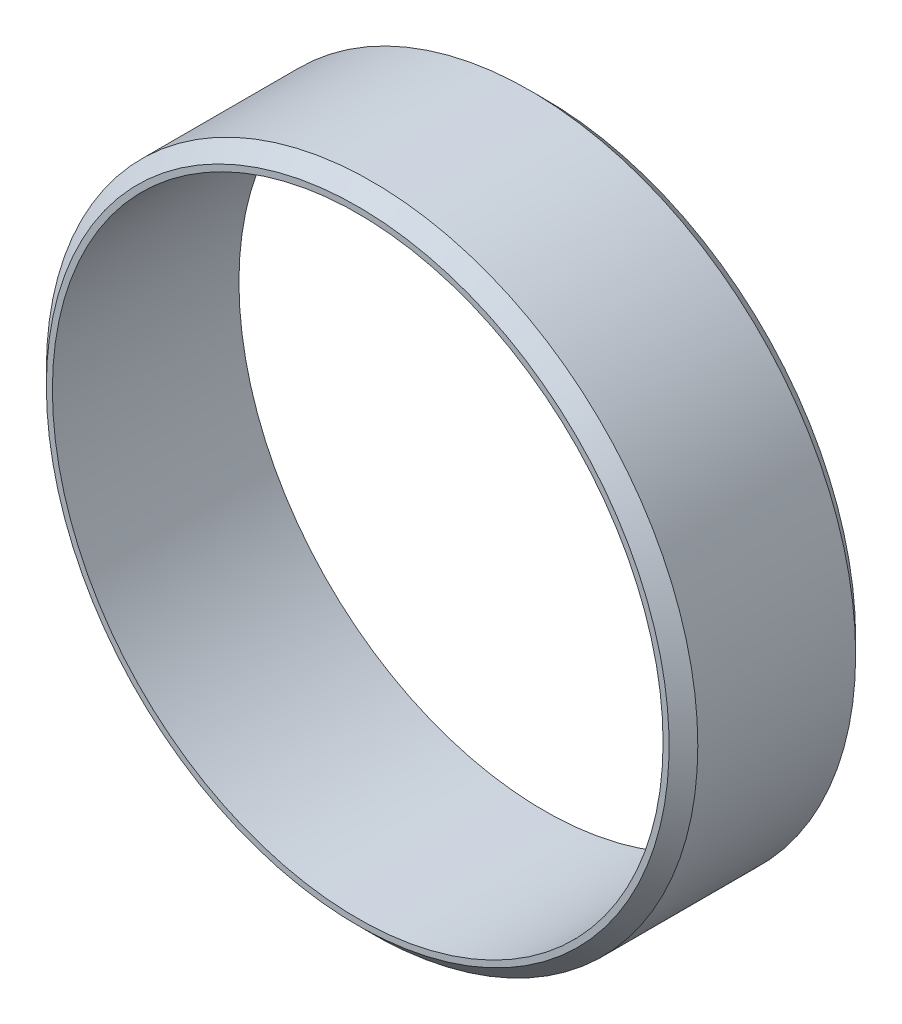
ISO-10303-21;
HEADER;
FILE_DESCRIPTION(('STEP AP214'),'2;1');
FILE_NAME('part.step','',(''),(''),'','','');
FILE_SCHEMA(('AUTOMOTIVE_DESIGN { 1 0 10303 214 1 1 1 1 }'));
ENDSEC;
DATA;
#1=APPLICATION_CONTEXT('core data for automotive mechanical design processes');
#2=APPLICATION_PROTOCOL_DEFINITION('international standard','automotive_design',2000,#1);
#3=PRODUCT_CONTEXT('',#1,'mechanical');
#4=PRODUCT('Part','Part','',(#3));
#5=PRODUCT_RELATED_PRODUCT_CATEGORY('part','',(#4));
#6=PRODUCT_DEFINITION_FORMATION('','',#4);
#7=PRODUCT_DEFINITION_CONTEXT('part definition',#1,'design');
#8=PRODUCT_DEFINITION('design','',#6,#7);
#9=PRODUCT_DEFINITION_SHAPE('','',#8);
#10=(LENGTH_UNIT() NAMED_UNIT(*) SI_UNIT(.MILLI.,.METRE.));
#11=(NAMED_UNIT(*) PLANE_ANGLE_UNIT() SI_UNIT($,.RADIAN.));
#12=(NAMED_UNIT(*) SI_UNIT($,.STERADIAN.) SOLID_ANGLE_UNIT());
#13=UNCERTAINTY_MEASURE_WITH_UNIT(LENGTH_MEASURE(1.E-05),#10,'distance_accuracy_value','');
#14=(GEOMETRIC_REPRESENTATION_CONTEXT(3) GLOBAL_UNCERTAINTY_ASSIGNED_CONTEXT((#13)) GLOBAL_UNIT_ASSIGNED_CONTEXT((#10,
#11,#12)) REPRESENTATION_CONTEXT('',''));
#15=CARTESIAN_POINT('',(0.,0.,0.));
#16=DIRECTION('',(0.,0.,1.));
#17=DIRECTION('',(1.,0.,0.));
#18=AXIS2_PLACEMENT_3D('',#15,#16,#17);
#19=CARTESIAN_POINT('',(0.,0.,-6.));
#20=DIRECTION('',(0.,0.,1.));
#21=DIRECTION('',(1.,0.,0.));
#22=AXIS2_PLACEMENT_3D('',#19,#20,#21);
#23=CYLINDRICAL_SURFACE('',#22,34.05);
#24=CARTESIAN_POINT('',(0.,0.,-4.49999999999998));
#25=DIRECTION('',(0.,0.,1.));
#26=DIRECTION('',(1.,0.,0.));
#27=AXIS2_PLACEMENT_3D('',#24,#25,#26);
#28=CIRCLE('',#27,34.05);
#29=CARTESIAN_POINT('',(34.05,0.,-4.49999999999999));
#30=VERTEX_POINT('',#29);
#31=EDGE_CURVE('E36',#30,#30,#28,.F.);
#32=ORIENTED_EDGE('',*,*,#31,.F.);
#33=EDGE_LOOP('',(#32));
#34=FACE_BOUND('',#33,.T.);
#35=CARTESIAN_POINT('',(0.,0.,12.));
#36=DIRECTION('',(0.,0.,-1.));
#37=DIRECTION('',(-1.,0.,0.));
#38=AXIS2_PLACEMENT_3D('',#35,#36,#37);
#39=CIRCLE('',#38,34.05);
#40=CARTESIAN_POINT('',(-34.05,0.,12.));
#41=VERTEX_POINT('',#40);
#42=EDGE_CURVE('E30',#41,#41,#39,.F.);
#43=ORIENTED_EDGE('',*,*,#42,.F.);
#44=EDGE_LOOP('',(#43));
#45=FACE_BOUND('',#44,.T.);
#46=ADVANCED_FACE('F15',(#34,#45),#23,.T.);
#47=CARTESIAN_POINT('',(0.,0.,12.));
#48=DIRECTION('',(0.,0.,-1.));
#49=DIRECTION('',(-1.,0.,0.));
#50=AXIS2_PLACEMENT_3D('',#47,#48,#49);
#51=CONICAL_SURFACE('',#50,34.05,0.785398163397445);
#52=ORIENTED_EDGE('',*,*,#42,.T.);
#53=EDGE_LOOP('',(#52));
#54=FACE_BOUND('',#53,.T.);
#55=CARTESIAN_POINT('',(0.,0.,13.5));
#56=DIRECTION('',(0.,0.,-1.));
#57=DIRECTION('',(-1.,0.,0.));
#58=AXIS2_PLACEMENT_3D('',#55,#56,#57);
#59=CIRCLE('',#58,32.55);
#60=CARTESIAN_POINT('',(-32.55,0.,13.5));
#61=VERTEX_POINT('',#60);
#62=EDGE_CURVE('E18',#61,#61,#59,.F.);
#63=ORIENTED_EDGE('',*,*,#62,.F.);
#64=EDGE_LOOP('',(#63));
#65=FACE_BOUND('',#64,.T.);
#66=ADVANCED_FACE('F45',(#54,#65),#51,.T.);
#67=CARTESIAN_POINT('',(0.,0.,-4.49999999999998));
#68=DIRECTION('',(0.,0.,1.));
#69=DIRECTION('',(1.,0.,0.));
#70=AXIS2_PLACEMENT_3D('',#67,#68,#69);
#71=CONICAL_SURFACE('',#70,34.05,0.785398163397451);
#72=CARTESIAN_POINT('',(0.,0.,-6.));
#73=DIRECTION('',(0.,0.,1.));
#74=DIRECTION('',(1.,0.,0.));
#75=AXIS2_PLACEMENT_3D('',#72,#73,#74);
#76=CIRCLE('',#75,32.55);
#77=CARTESIAN_POINT('',(32.55,0.,-6.));
#78=VERTEX_POINT('',#77);
#79=EDGE_CURVE('E27',#78,#78,#76,.T.);
#80=ORIENTED_EDGE('',*,*,#79,.T.);
#81=EDGE_LOOP('',(#80));
#82=FACE_BOUND('',#81,.T.);
#83=ORIENTED_EDGE('',*,*,#31,.T.);
#84=EDGE_LOOP('',(#83));
#85=FACE_BOUND('',#84,.T.);
#86=ADVANCED_FACE('F54',(#82,#85),#71,.T.);
#87=CARTESIAN_POINT('',(0.,0.,13.5));
#88=DIRECTION('',(0.,0.,1.));
#89=DIRECTION('',(1.,0.,0.));
#90=AXIS2_PLACEMENT_3D('',#87,#88,#89);
#91=PLANE('',#90);
#92=CARTESIAN_POINT('',(0.,0.,13.5));
#93=DIRECTION('',(0.,0.,1.));
#94=DIRECTION('',(1.,0.,0.));
#95=AXIS2_PLACEMENT_3D('',#92,#93,#94);
#96=CIRCLE('',#95,31.92);
#97=CARTESIAN_POINT('',(31.92,0.,13.5));
#98=VERTEX_POINT('',#97);
#99=EDGE_CURVE('E22',#98,#98,#96,.F.);
#100=ORIENTED_EDGE('',*,*,#99,.T.);
#101=EDGE_LOOP('',(#100));
#102=FACE_BOUND('',#101,.T.);
#103=ORIENTED_EDGE('',*,*,#62,.T.);
#104=EDGE_LOOP('',(#103));
#105=FACE_BOUND('',#104,.T.);
#106=ADVANCED_FACE('F63',(#102,#105),#91,.T.);
#107=CARTESIAN_POINT('',(0.,0.,-6.));
#108=DIRECTION('',(0.,0.,1.));
#109=DIRECTION('',(1.,0.,0.));
#110=AXIS2_PLACEMENT_3D('',#107,#108,#109);
#111=PLANE('',#110);
#112=CARTESIAN_POINT('',(0.,0.,-6.));
#113=DIRECTION('',(0.,0.,1.));
#114=DIRECTION('',(1.,0.,0.));
#115=AXIS2_PLACEMENT_3D('',#112,#113,#114);
#116=CIRCLE('',#115,31.92);
#117=CARTESIAN_POINT('',(31.92,0.,-6.));
#118=VERTEX_POINT('',#117);
#119=EDGE_CURVE('E10',#118,#118,#116,.T.);
#120=ORIENTED_EDGE('',*,*,#119,.T.);
#121=EDGE_LOOP('',(#120));
#122=FACE_BOUND('',#121,.T.);
#123=ORIENTED_EDGE('',*,*,#79,.F.);
#124=EDGE_LOOP('',(#123));
#125=FACE_BOUND('',#124,.T.);
#126=ADVANCED_FACE('F57',(#122,#125),#111,.F.);
#127=CARTESIAN_POINT('',(0.,0.,-6.));
#128=DIRECTION('',(0.,0.,1.));
#129=DIRECTION('',(1.,0.,0.));
#130=AXIS2_PLACEMENT_3D('',#127,#128,#129);
#131=CYLINDRICAL_SURFACE('',#130,31.92);
#132=ORIENTED_EDGE('',*,*,#99,.F.);
#133=EDGE_LOOP('',(#132));
#134=FACE_BOUND('',#133,.T.);
#135=ORIENTED_EDGE('',*,*,#119,.F.);
#136=EDGE_LOOP('',(#135));
#137=FACE_BOUND('',#136,.T.);
#138=ADVANCED_FACE('F55',(#134,#137),#131,.F.);
#139=CLOSED_SHELL('',(#46,#66,#86,#106,#126,#138));
#140=MANIFOLD_SOLID_BREP('B1',#139);
#141=ADVANCED_BREP_SHAPE_REPRESENTATION('',(#18,#140),#14);
#142=SHAPE_DEFINITION_REPRESENTATION(#9,#141);
ENDSEC;
END-ISO-10303-21;
